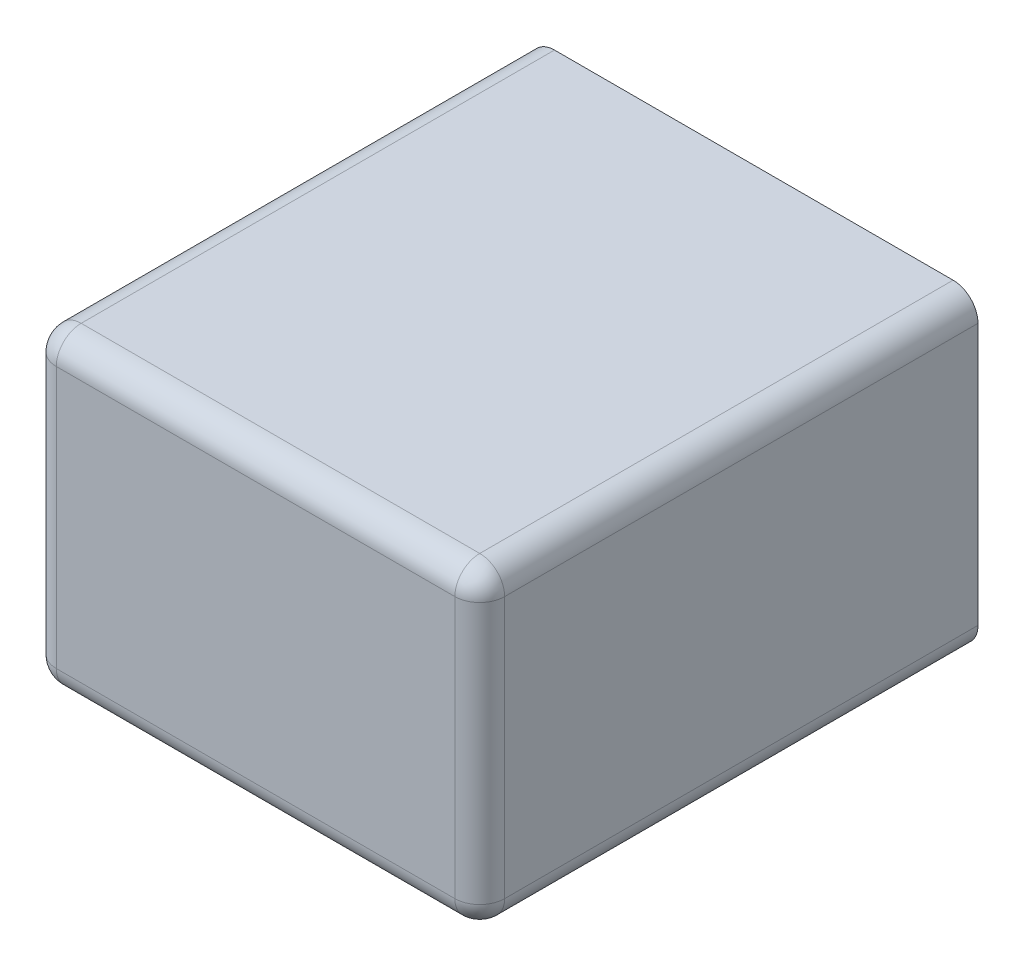
ISO-10303-21;
HEADER;
FILE_DESCRIPTION(('STEP AP214'),'2;1');
FILE_NAME('part.step','',(''),(''),'','','');
FILE_SCHEMA(('AUTOMOTIVE_DESIGN { 1 0 10303 214 1 1 1 1 }'));
ENDSEC;
DATA;
#1=APPLICATION_CONTEXT('core data for automotive mechanical design processes');
#2=APPLICATION_PROTOCOL_DEFINITION('international standard','automotive_design',2000,#1);
#3=PRODUCT_CONTEXT('',#1,'mechanical');
#4=PRODUCT('Part','Part','',(#3));
#5=PRODUCT_RELATED_PRODUCT_CATEGORY('part','',(#4));
#6=PRODUCT_DEFINITION_FORMATION('','',#4);
#7=PRODUCT_DEFINITION_CONTEXT('part definition',#1,'design');
#8=PRODUCT_DEFINITION('design','',#6,#7);
#9=PRODUCT_DEFINITION_SHAPE('','',#8);
#10=(LENGTH_UNIT() NAMED_UNIT(*) SI_UNIT(.MILLI.,.METRE.));
#11=(NAMED_UNIT(*) PLANE_ANGLE_UNIT() SI_UNIT($,.RADIAN.));
#12=(NAMED_UNIT(*) SI_UNIT($,.STERADIAN.) SOLID_ANGLE_UNIT());
#13=UNCERTAINTY_MEASURE_WITH_UNIT(LENGTH_MEASURE(1.E-05),#10,'distance_accuracy_value','');
#14=(GEOMETRIC_REPRESENTATION_CONTEXT(3) GLOBAL_UNCERTAINTY_ASSIGNED_CONTEXT((#13)) GLOBAL_UNIT_ASSIGNED_CONTEXT((#10,
#11,#12)) REPRESENTATION_CONTEXT('',''));
#15=CARTESIAN_POINT('',(0.,0.,0.));
#16=DIRECTION('',(0.,0.,1.));
#17=DIRECTION('',(1.,0.,0.));
#18=AXIS2_PLACEMENT_3D('',#15,#16,#17);
#19=CARTESIAN_POINT('',(0.1,1.15,1.9));
#20=DIRECTION('',(0.,0.,1.));
#21=DIRECTION('',(-1.,0.,0.));
#22=AXIS2_PLACEMENT_3D('',#19,#20,#21);
#23=SPHERICAL_SURFACE('',#22,0.1);
#24=CARTESIAN_POINT('',(0.1,1.15,1.9));
#25=DIRECTION('',(0.,0.,1.));
#26=DIRECTION('',(1.,0.,0.));
#27=AXIS2_PLACEMENT_3D('',#24,#25,#26);
#28=CIRCLE('',#27,0.1);
#29=CARTESIAN_POINT('',(0.,1.15,1.9));
#30=VERTEX_POINT('',#29);
#31=CARTESIAN_POINT('',(0.1,1.25,1.9));
#32=VERTEX_POINT('',#31);
#33=EDGE_CURVE('E102',#30,#32,#28,.F.);
#34=ORIENTED_EDGE('',*,*,#33,.F.);
#35=CARTESIAN_POINT('',(0.1,1.15,1.9));
#36=DIRECTION('',(0.,1.,0.));
#37=DIRECTION('',(0.,0.,1.));
#38=AXIS2_PLACEMENT_3D('',#35,#36,#37);
#39=CIRCLE('',#38,0.1);
#40=CARTESIAN_POINT('',(0.1,1.15,2.));
#41=VERTEX_POINT('',#40);
#42=EDGE_CURVE('E136',#41,#30,#39,.F.);
#43=ORIENTED_EDGE('',*,*,#42,.F.);
#44=CARTESIAN_POINT('',(0.1,1.15,1.9));
#45=DIRECTION('',(1.,0.,0.));
#46=DIRECTION('',(0.,0.,-1.));
#47=AXIS2_PLACEMENT_3D('',#44,#45,#46);
#48=CIRCLE('',#47,0.1);
#49=EDGE_CURVE('E116',#32,#41,#48,.T.);
#50=ORIENTED_EDGE('',*,*,#49,.F.);
#51=EDGE_LOOP('',(#34,#43,#50));
#52=FACE_BOUND('',#51,.T.);
#53=ADVANCED_FACE('F17',(#52),#23,.T.);
#54=CARTESIAN_POINT('',(0.,1.25,0.));
#55=DIRECTION('',(0.,1.,0.));
#56=DIRECTION('',(0.,0.,1.));
#57=AXIS2_PLACEMENT_3D('',#54,#55,#56);
#58=PLANE('',#57);
#59=DIRECTION('',(1.,0.,0.));
#60=VECTOR('',#59,1.);
#61=CARTESIAN_POINT('',(0.,1.25,1.9));
#62=LINE('',#61,#60);
#63=CARTESIAN_POINT('',(1.7,1.25,1.9));
#64=VERTEX_POINT('',#63);
#65=EDGE_CURVE('E123',#64,#32,#62,.F.);
#66=ORIENTED_EDGE('',*,*,#65,.F.);
#67=DIRECTION('',(0.,0.,1.));
#68=VECTOR('',#67,1.);
#69=CARTESIAN_POINT('',(1.7,1.25,0.));
#70=LINE('',#69,#68);
#71=CARTESIAN_POINT('',(1.7,1.25,0.));
#72=VERTEX_POINT('',#71);
#73=EDGE_CURVE('E99',#72,#64,#70,.T.);
#74=ORIENTED_EDGE('',*,*,#73,.F.);
#75=DIRECTION('',(1.,0.,0.));
#76=VECTOR('',#75,1.);
#77=CARTESIAN_POINT('',(0.,1.25,0.));
#78=LINE('',#77,#76);
#79=CARTESIAN_POINT('',(0.1,1.25,0.));
#80=VERTEX_POINT('',#79);
#81=EDGE_CURVE('E93',#72,#80,#78,.F.);
#82=ORIENTED_EDGE('',*,*,#81,.T.);
#83=DIRECTION('',(0.,0.,1.));
#84=VECTOR('',#83,1.);
#85=CARTESIAN_POINT('',(0.1,1.25,0.));
#86=LINE('',#85,#84);
#87=EDGE_CURVE('E97',#32,#80,#86,.F.);
#88=ORIENTED_EDGE('',*,*,#87,.F.);
#89=EDGE_LOOP('',(#66,#74,#82,#88));
#90=FACE_BOUND('',#89,.T.);
#91=ADVANCED_FACE('F96',(#90),#58,.T.);
#92=CARTESIAN_POINT('',(1.7,1.15,1.9));
#93=DIRECTION('',(0.,0.,1.));
#94=DIRECTION('',(-1.,0.,0.));
#95=AXIS2_PLACEMENT_3D('',#92,#93,#94);
#96=SPHERICAL_SURFACE('',#95,0.1);
#97=CARTESIAN_POINT('',(1.7,1.15,1.9));
#98=DIRECTION('',(0.,0.,1.));
#99=DIRECTION('',(1.,0.,0.));
#100=AXIS2_PLACEMENT_3D('',#97,#98,#99);
#101=CIRCLE('',#100,0.1);
#102=CARTESIAN_POINT('',(1.8,1.15,1.9));
#103=VERTEX_POINT('',#102);
#104=EDGE_CURVE('E151',#64,#103,#101,.F.);
#105=ORIENTED_EDGE('',*,*,#104,.F.);
#106=CARTESIAN_POINT('',(1.7,1.15,1.9));
#107=DIRECTION('',(1.,0.,0.));
#108=DIRECTION('',(0.,0.,-1.));
#109=AXIS2_PLACEMENT_3D('',#106,#107,#108);
#110=CIRCLE('',#109,0.1);
#111=CARTESIAN_POINT('',(1.7,1.15,2.));
#112=VERTEX_POINT('',#111);
#113=EDGE_CURVE('E117',#112,#64,#110,.F.);
#114=ORIENTED_EDGE('',*,*,#113,.F.);
#115=CARTESIAN_POINT('',(1.7,1.15,1.9));
#116=DIRECTION('',(0.,1.,0.));
#117=DIRECTION('',(0.,0.,1.));
#118=AXIS2_PLACEMENT_3D('',#115,#116,#117);
#119=CIRCLE('',#118,0.1);
#120=EDGE_CURVE('E256',#103,#112,#119,.F.);
#121=ORIENTED_EDGE('',*,*,#120,.F.);
#122=EDGE_LOOP('',(#105,#114,#121));
#123=FACE_BOUND('',#122,.T.);
#124=ADVANCED_FACE('F167',(#123),#96,.T.);
#125=CARTESIAN_POINT('',(0.1,1.15,0.));
#126=DIRECTION('',(0.,0.,1.));
#127=DIRECTION('',(1.,0.,0.));
#128=AXIS2_PLACEMENT_3D('',#125,#126,#127);
#129=CYLINDRICAL_SURFACE('',#128,0.1);
#130=ORIENTED_EDGE('',*,*,#87,.T.);
#131=CARTESIAN_POINT('',(0.1,1.15,0.));
#132=DIRECTION('',(0.,0.,1.));
#133=DIRECTION('',(1.,0.,0.));
#134=AXIS2_PLACEMENT_3D('',#131,#132,#133);
#135=CIRCLE('',#134,0.1);
#136=CARTESIAN_POINT('',(0.,1.15,0.));
#137=VERTEX_POINT('',#136);
#138=EDGE_CURVE('E21',#80,#137,#135,.T.);
#139=ORIENTED_EDGE('',*,*,#138,.T.);
#140=DIRECTION('',(0.,0.,-1.));
#141=VECTOR('',#140,1.);
#142=CARTESIAN_POINT('',(0.,1.15,0.));
#143=LINE('',#142,#141);
#144=EDGE_CURVE('E260',#137,#30,#143,.F.);
#145=ORIENTED_EDGE('',*,*,#144,.T.);
#146=ORIENTED_EDGE('',*,*,#33,.T.);
#147=EDGE_LOOP('',(#130,#139,#145,#146));
#148=FACE_BOUND('',#147,.T.);
#149=ADVANCED_FACE('F106',(#148),#129,.T.);
#150=CARTESIAN_POINT('',(0.,1.15,1.9));
#151=DIRECTION('',(1.,0.,0.));
#152=DIRECTION('',(0.,0.,-1.));
#153=AXIS2_PLACEMENT_3D('',#150,#151,#152);
#154=CYLINDRICAL_SURFACE('',#153,0.1);
#155=ORIENTED_EDGE('',*,*,#113,.T.);
#156=ORIENTED_EDGE('',*,*,#65,.T.);
#157=ORIENTED_EDGE('',*,*,#49,.T.);
#158=DIRECTION('',(1.,0.,0.));
#159=VECTOR('',#158,1.);
#160=CARTESIAN_POINT('',(0.,1.15,2.));
#161=LINE('',#160,#159);
#162=EDGE_CURVE('E132',#112,#41,#161,.F.);
#163=ORIENTED_EDGE('',*,*,#162,.F.);
#164=EDGE_LOOP('',(#155,#156,#157,#163));
#165=FACE_BOUND('',#164,.T.);
#166=ADVANCED_FACE('F248',(#165),#154,.T.);
#167=CARTESIAN_POINT('',(0.1,0.,1.9));
#168=DIRECTION('',(0.,1.,0.));
#169=DIRECTION('',(0.,0.,1.));
#170=AXIS2_PLACEMENT_3D('',#167,#168,#169);
#171=CYLINDRICAL_SURFACE('',#170,0.1);
#172=ORIENTED_EDGE('',*,*,#42,.T.);
#173=DIRECTION('',(0.,1.,0.));
#174=VECTOR('',#173,1.);
#175=CARTESIAN_POINT('',(0.,0.,1.9));
#176=LINE('',#175,#174);
#177=CARTESIAN_POINT('',(0.,0.1,1.9));
#178=VERTEX_POINT('',#177);
#179=EDGE_CURVE('E275',#30,#178,#176,.F.);
#180=ORIENTED_EDGE('',*,*,#179,.T.);
#181=CARTESIAN_POINT('',(0.1,0.1,1.9));
#182=DIRECTION('',(0.,-1.,0.));
#183=DIRECTION('',(0.,0.,-1.));
#184=AXIS2_PLACEMENT_3D('',#181,#182,#183);
#185=CIRCLE('',#184,0.1);
#186=CARTESIAN_POINT('',(0.1,0.1,2.));
#187=VERTEX_POINT('',#186);
#188=EDGE_CURVE('E131',#187,#178,#185,.T.);
#189=ORIENTED_EDGE('',*,*,#188,.F.);
#190=DIRECTION('',(0.,1.,0.));
#191=VECTOR('',#190,1.);
#192=CARTESIAN_POINT('',(0.1,0.,2.));
#193=LINE('',#192,#191);
#194=EDGE_CURVE('E129',#41,#187,#193,.F.);
#195=ORIENTED_EDGE('',*,*,#194,.F.);
#196=EDGE_LOOP('',(#172,#180,#189,#195));
#197=FACE_BOUND('',#196,.T.);
#198=ADVANCED_FACE('F246',(#197),#171,.T.);
#199=CARTESIAN_POINT('',(1.7,1.15,0.));
#200=DIRECTION('',(0.,0.,1.));
#201=DIRECTION('',(1.,0.,0.));
#202=AXIS2_PLACEMENT_3D('',#199,#200,#201);
#203=CYLINDRICAL_SURFACE('',#202,0.1);
#204=ORIENTED_EDGE('',*,*,#104,.T.);
#205=DIRECTION('',(0.,0.,-1.));
#206=VECTOR('',#205,1.);
#207=CARTESIAN_POINT('',(1.8,1.15,0.));
#208=LINE('',#207,#206);
#209=CARTESIAN_POINT('',(1.8,1.15,0.));
#210=VERTEX_POINT('',#209);
#211=EDGE_CURVE('E214',#210,#103,#208,.F.);
#212=ORIENTED_EDGE('',*,*,#211,.F.);
#213=CARTESIAN_POINT('',(1.7,1.15,0.));
#214=DIRECTION('',(0.,0.,1.));
#215=DIRECTION('',(1.,0.,0.));
#216=AXIS2_PLACEMENT_3D('',#213,#214,#215);
#217=CIRCLE('',#216,0.1);
#218=EDGE_CURVE('E148',#210,#72,#217,.T.);
#219=ORIENTED_EDGE('',*,*,#218,.T.);
#220=ORIENTED_EDGE('',*,*,#73,.T.);
#221=EDGE_LOOP('',(#204,#212,#219,#220));
#222=FACE_BOUND('',#221,.T.);
#223=ADVANCED_FACE('F242',(#222),#203,.T.);
#224=CARTESIAN_POINT('',(1.7,0.,1.9));
#225=DIRECTION('',(0.,1.,0.));
#226=DIRECTION('',(0.,0.,1.));
#227=AXIS2_PLACEMENT_3D('',#224,#225,#226);
#228=CYLINDRICAL_SURFACE('',#227,0.1);
#229=DIRECTION('',(0.,1.,0.));
#230=VECTOR('',#229,1.);
#231=CARTESIAN_POINT('',(1.7,0.,2.));
#232=LINE('',#231,#230);
#233=CARTESIAN_POINT('',(1.7,0.1,2.));
#234=VERTEX_POINT('',#233);
#235=EDGE_CURVE('E270',#234,#112,#232,.T.);
#236=ORIENTED_EDGE('',*,*,#235,.F.);
#237=CARTESIAN_POINT('',(1.7,0.1,1.9));
#238=DIRECTION('',(0.,-1.,0.));
#239=DIRECTION('',(0.,0.,1.));
#240=AXIS2_PLACEMENT_3D('',#237,#238,#239);
#241=CIRCLE('',#240,0.1);
#242=CARTESIAN_POINT('',(1.8,0.1,1.9));
#243=VERTEX_POINT('',#242);
#244=EDGE_CURVE('E213',#243,#234,#241,.T.);
#245=ORIENTED_EDGE('',*,*,#244,.F.);
#246=DIRECTION('',(0.,1.,0.));
#247=VECTOR('',#246,1.);
#248=CARTESIAN_POINT('',(1.8,0.,1.9));
#249=LINE('',#248,#247);
#250=EDGE_CURVE('E211',#103,#243,#249,.F.);
#251=ORIENTED_EDGE('',*,*,#250,.F.);
#252=ORIENTED_EDGE('',*,*,#120,.T.);
#253=EDGE_LOOP('',(#236,#245,#251,#252));
#254=FACE_BOUND('',#253,.T.);
#255=ADVANCED_FACE('F238',(#254),#228,.T.);
#256=CARTESIAN_POINT('',(0.,0.,0.));
#257=DIRECTION('',(1.,0.,0.));
#258=DIRECTION('',(0.,0.,-1.));
#259=AXIS2_PLACEMENT_3D('',#256,#257,#258);
#260=PLANE('',#259);
#261=ORIENTED_EDGE('',*,*,#179,.F.);
#262=ORIENTED_EDGE('',*,*,#144,.F.);
#263=DIRECTION('',(0.,1.,0.));
#264=VECTOR('',#263,1.);
#265=CARTESIAN_POINT('',(0.,0.,0.));
#266=LINE('',#265,#264);
#267=CARTESIAN_POINT('',(0.,0.1,0.));
#268=VERTEX_POINT('',#267);
#269=EDGE_CURVE('E115',#137,#268,#266,.F.);
#270=ORIENTED_EDGE('',*,*,#269,.T.);
#271=DIRECTION('',(0.,0.,1.));
#272=VECTOR('',#271,1.);
#273=CARTESIAN_POINT('',(0.,0.1,0.));
#274=LINE('',#273,#272);
#275=EDGE_CURVE('E292',#178,#268,#274,.F.);
#276=ORIENTED_EDGE('',*,*,#275,.F.);
#277=EDGE_LOOP('',(#261,#262,#270,#276));
#278=FACE_BOUND('',#277,.T.);
#279=ADVANCED_FACE('F234',(#278),#260,.F.);
#280=CARTESIAN_POINT('',(0.,0.,2.));
#281=DIRECTION('',(0.,0.,1.));
#282=DIRECTION('',(1.,0.,0.));
#283=AXIS2_PLACEMENT_3D('',#280,#281,#282);
#284=PLANE('',#283);
#285=ORIENTED_EDGE('',*,*,#162,.T.);
#286=ORIENTED_EDGE('',*,*,#194,.T.);
#287=DIRECTION('',(1.,0.,0.));
#288=VECTOR('',#287,1.);
#289=CARTESIAN_POINT('',(0.,0.1,2.));
#290=LINE('',#289,#288);
#291=EDGE_CURVE('E291',#234,#187,#290,.F.);
#292=ORIENTED_EDGE('',*,*,#291,.F.);
#293=ORIENTED_EDGE('',*,*,#235,.T.);
#294=EDGE_LOOP('',(#285,#286,#292,#293));
#295=FACE_BOUND('',#294,.T.);
#296=ADVANCED_FACE('F230',(#295),#284,.T.);
#297=CARTESIAN_POINT('',(0.1,0.1,1.9));
#298=DIRECTION('',(0.,-1.,0.));
#299=DIRECTION('',(0.,0.,-1.));
#300=AXIS2_PLACEMENT_3D('',#297,#298,#299);
#301=SPHERICAL_SURFACE('',#300,0.1);
#302=ORIENTED_EDGE('',*,*,#188,.T.);
#303=CARTESIAN_POINT('',(0.1,0.1,1.9));
#304=DIRECTION('',(0.,0.,1.));
#305=DIRECTION('',(1.,0.,0.));
#306=AXIS2_PLACEMENT_3D('',#303,#304,#305);
#307=CIRCLE('',#306,0.1);
#308=CARTESIAN_POINT('',(0.1,0.,1.9));
#309=VERTEX_POINT('',#308);
#310=EDGE_CURVE('E146',#309,#178,#307,.F.);
#311=ORIENTED_EDGE('',*,*,#310,.F.);
#312=CARTESIAN_POINT('',(0.1,0.1,1.9));
#313=DIRECTION('',(1.,0.,0.));
#314=DIRECTION('',(0.,0.,-1.));
#315=AXIS2_PLACEMENT_3D('',#312,#313,#314);
#316=CIRCLE('',#315,0.1);
#317=EDGE_CURVE('E299',#187,#309,#316,.T.);
#318=ORIENTED_EDGE('',*,*,#317,.F.);
#319=EDGE_LOOP('',(#302,#311,#318));
#320=FACE_BOUND('',#319,.T.);
#321=ADVANCED_FACE('F227',(#320),#301,.T.);
#322=CARTESIAN_POINT('',(1.8,0.,0.));
#323=DIRECTION('',(1.,0.,0.));
#324=DIRECTION('',(0.,0.,-1.));
#325=AXIS2_PLACEMENT_3D('',#322,#323,#324);
#326=PLANE('',#325);
#327=ORIENTED_EDGE('',*,*,#250,.T.);
#328=DIRECTION('',(0.,0.,1.));
#329=VECTOR('',#328,1.);
#330=CARTESIAN_POINT('',(1.8,0.1,0.));
#331=LINE('',#330,#329);
#332=CARTESIAN_POINT('',(1.8,0.1,0.));
#333=VERTEX_POINT('',#332);
#334=EDGE_CURVE('E221',#333,#243,#331,.T.);
#335=ORIENTED_EDGE('',*,*,#334,.F.);
#336=DIRECTION('',(0.,1.,0.));
#337=VECTOR('',#336,1.);
#338=CARTESIAN_POINT('',(1.8,0.,0.));
#339=LINE('',#338,#337);
#340=EDGE_CURVE('E147',#333,#210,#339,.T.);
#341=ORIENTED_EDGE('',*,*,#340,.T.);
#342=ORIENTED_EDGE('',*,*,#211,.T.);
#343=EDGE_LOOP('',(#327,#335,#341,#342));
#344=FACE_BOUND('',#343,.T.);
#345=ADVANCED_FACE('F203',(#344),#326,.T.);
#346=CARTESIAN_POINT('',(1.7,0.1,1.9));
#347=DIRECTION('',(0.,-1.,0.));
#348=DIRECTION('',(0.,0.,1.));
#349=AXIS2_PLACEMENT_3D('',#346,#347,#348);
#350=SPHERICAL_SURFACE('',#349,0.1);
#351=ORIENTED_EDGE('',*,*,#244,.T.);
#352=CARTESIAN_POINT('',(1.7,0.1,1.9));
#353=DIRECTION('',(1.,0.,0.));
#354=DIRECTION('',(0.,0.,-1.));
#355=AXIS2_PLACEMENT_3D('',#352,#353,#354);
#356=CIRCLE('',#355,0.1);
#357=CARTESIAN_POINT('',(1.7,0.,1.9));
#358=VERTEX_POINT('',#357);
#359=EDGE_CURVE('E288',#358,#234,#356,.F.);
#360=ORIENTED_EDGE('',*,*,#359,.F.);
#361=CARTESIAN_POINT('',(1.7,0.1,1.9));
#362=DIRECTION('',(0.,0.,1.));
#363=DIRECTION('',(1.,0.,0.));
#364=AXIS2_PLACEMENT_3D('',#361,#362,#363);
#365=CIRCLE('',#364,0.1);
#366=EDGE_CURVE('E35',#243,#358,#365,.F.);
#367=ORIENTED_EDGE('',*,*,#366,.F.);
#368=EDGE_LOOP('',(#351,#360,#367));
#369=FACE_BOUND('',#368,.T.);
#370=ADVANCED_FACE('F199',(#369),#350,.T.);
#371=CARTESIAN_POINT('',(0.,0.,0.));
#372=DIRECTION('',(0.,0.,1.));
#373=DIRECTION('',(1.,0.,0.));
#374=AXIS2_PLACEMENT_3D('',#371,#372,#373);
#375=PLANE('',#374);
#376=ORIENTED_EDGE('',*,*,#81,.F.);
#377=ORIENTED_EDGE('',*,*,#218,.F.);
#378=ORIENTED_EDGE('',*,*,#340,.F.);
#379=CARTESIAN_POINT('',(1.7,0.1,0.));
#380=DIRECTION('',(0.,0.,1.));
#381=DIRECTION('',(1.,0.,0.));
#382=AXIS2_PLACEMENT_3D('',#379,#380,#381);
#383=CIRCLE('',#382,0.1);
#384=CARTESIAN_POINT('',(1.7,0.,0.));
#385=VERTEX_POINT('',#384);
#386=EDGE_CURVE('E141',#385,#333,#383,.T.);
#387=ORIENTED_EDGE('',*,*,#386,.F.);
#388=DIRECTION('',(1.,0.,0.));
#389=VECTOR('',#388,1.);
#390=CARTESIAN_POINT('',(0.,0.,0.));
#391=LINE('',#390,#389);
#392=CARTESIAN_POINT('',(0.1,0.,0.));
#393=VERTEX_POINT('',#392);
#394=EDGE_CURVE('E144',#385,#393,#391,.F.);
#395=ORIENTED_EDGE('',*,*,#394,.T.);
#396=CARTESIAN_POINT('',(0.1,0.1,0.));
#397=DIRECTION('',(0.,0.,1.));
#398=DIRECTION('',(1.,0.,0.));
#399=AXIS2_PLACEMENT_3D('',#396,#397,#398);
#400=CIRCLE('',#399,0.1);
#401=EDGE_CURVE('E145',#268,#393,#400,.T.);
#402=ORIENTED_EDGE('',*,*,#401,.F.);
#403=ORIENTED_EDGE('',*,*,#269,.F.);
#404=ORIENTED_EDGE('',*,*,#138,.F.);
#405=EDGE_LOOP('',(#376,#377,#378,#387,#395,#402,#403,#404));
#406=FACE_BOUND('',#405,.T.);
#407=ADVANCED_FACE('F113',(#406),#375,.F.);
#408=CARTESIAN_POINT('',(0.1,0.1,0.));
#409=DIRECTION('',(0.,0.,1.));
#410=DIRECTION('',(1.,0.,0.));
#411=AXIS2_PLACEMENT_3D('',#408,#409,#410);
#412=CYLINDRICAL_SURFACE('',#411,0.1);
#413=ORIENTED_EDGE('',*,*,#310,.T.);
#414=ORIENTED_EDGE('',*,*,#275,.T.);
#415=ORIENTED_EDGE('',*,*,#401,.T.);
#416=DIRECTION('',(0.,0.,1.));
#417=VECTOR('',#416,1.);
#418=CARTESIAN_POINT('',(0.1,0.,0.));
#419=LINE('',#418,#417);
#420=EDGE_CURVE('E314',#393,#309,#419,.T.);
#421=ORIENTED_EDGE('',*,*,#420,.T.);
#422=EDGE_LOOP('',(#413,#414,#415,#421));
#423=FACE_BOUND('',#422,.T.);
#424=ADVANCED_FACE('F192',(#423),#412,.T.);
#425=CARTESIAN_POINT('',(0.,0.1,1.9));
#426=DIRECTION('',(1.,0.,0.));
#427=DIRECTION('',(0.,0.,-1.));
#428=AXIS2_PLACEMENT_3D('',#425,#426,#427);
#429=CYLINDRICAL_SURFACE('',#428,0.1);
#430=ORIENTED_EDGE('',*,*,#317,.T.);
#431=DIRECTION('',(1.,0.,0.));
#432=VECTOR('',#431,1.);
#433=CARTESIAN_POINT('',(0.,0.,1.9));
#434=LINE('',#433,#432);
#435=EDGE_CURVE('E27',#309,#358,#434,.T.);
#436=ORIENTED_EDGE('',*,*,#435,.T.);
#437=ORIENTED_EDGE('',*,*,#359,.T.);
#438=ORIENTED_EDGE('',*,*,#291,.T.);
#439=EDGE_LOOP('',(#430,#436,#437,#438));
#440=FACE_BOUND('',#439,.T.);
#441=ADVANCED_FACE('F186',(#440),#429,.T.);
#442=CARTESIAN_POINT('',(1.7,0.1,0.));
#443=DIRECTION('',(0.,0.,1.));
#444=DIRECTION('',(1.,0.,0.));
#445=AXIS2_PLACEMENT_3D('',#442,#443,#444);
#446=CYLINDRICAL_SURFACE('',#445,0.1);
#447=DIRECTION('',(0.,0.,1.));
#448=VECTOR('',#447,1.);
#449=CARTESIAN_POINT('',(1.7,0.,0.));
#450=LINE('',#449,#448);
#451=EDGE_CURVE('E11',#358,#385,#450,.F.);
#452=ORIENTED_EDGE('',*,*,#451,.T.);
#453=ORIENTED_EDGE('',*,*,#386,.T.);
#454=ORIENTED_EDGE('',*,*,#334,.T.);
#455=ORIENTED_EDGE('',*,*,#366,.T.);
#456=EDGE_LOOP('',(#452,#453,#454,#455));
#457=FACE_BOUND('',#456,.T.);
#458=ADVANCED_FACE('F180',(#457),#446,.T.);
#459=CARTESIAN_POINT('',(0.,0.,0.));
#460=DIRECTION('',(0.,1.,0.));
#461=DIRECTION('',(0.,0.,1.));
#462=AXIS2_PLACEMENT_3D('',#459,#460,#461);
#463=PLANE('',#462);
#464=ORIENTED_EDGE('',*,*,#435,.F.);
#465=ORIENTED_EDGE('',*,*,#420,.F.);
#466=ORIENTED_EDGE('',*,*,#394,.F.);
#467=ORIENTED_EDGE('',*,*,#451,.F.);
#468=EDGE_LOOP('',(#464,#465,#466,#467));
#469=FACE_BOUND('',#468,.T.);
#470=ADVANCED_FACE('F178',(#469),#463,.F.);
#471=CLOSED_SHELL('',(#53,#91,#124,#149,#166,#198,#223,#255,#279,#296,#321,#345,#370,#407,#424,
#441,#458,#470));
#472=MANIFOLD_SOLID_BREP('B1',#471);
#473=ADVANCED_BREP_SHAPE_REPRESENTATION('',(#18,#472),#14);
#474=SHAPE_DEFINITION_REPRESENTATION(#9,#473);
ENDSEC;
END-ISO-10303-21;
